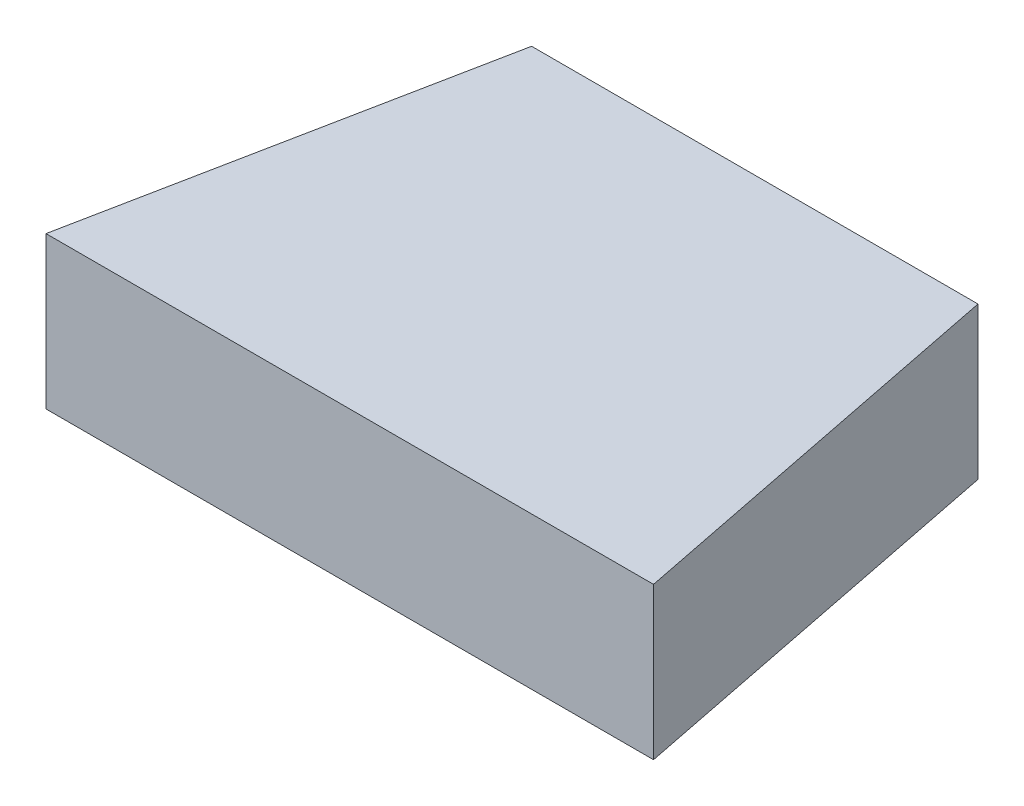
ISO-10303-21;
HEADER;
FILE_DESCRIPTION(('STEP AP214'),'2;1');
FILE_NAME('part.step','',(''),(''),'','','');
FILE_SCHEMA(('AUTOMOTIVE_DESIGN { 1 0 10303 214 1 1 1 1 }'));
ENDSEC;
DATA;
#1=APPLICATION_CONTEXT('core data for automotive mechanical design processes');
#2=APPLICATION_PROTOCOL_DEFINITION('international standard','automotive_design',2000,#1);
#3=PRODUCT_CONTEXT('',#1,'mechanical');
#4=PRODUCT('Part','Part','',(#3));
#5=PRODUCT_RELATED_PRODUCT_CATEGORY('part','',(#4));
#6=PRODUCT_DEFINITION_FORMATION('','',#4);
#7=PRODUCT_DEFINITION_CONTEXT('part definition',#1,'design');
#8=PRODUCT_DEFINITION('design','',#6,#7);
#9=PRODUCT_DEFINITION_SHAPE('','',#8);
#10=(LENGTH_UNIT() NAMED_UNIT(*) SI_UNIT(.MILLI.,.METRE.));
#11=(NAMED_UNIT(*) PLANE_ANGLE_UNIT() SI_UNIT($,.RADIAN.));
#12=(NAMED_UNIT(*) SI_UNIT($,.STERADIAN.) SOLID_ANGLE_UNIT());
#13=UNCERTAINTY_MEASURE_WITH_UNIT(LENGTH_MEASURE(1.E-05),#10,'distance_accuracy_value','');
#14=(GEOMETRIC_REPRESENTATION_CONTEXT(3) GLOBAL_UNCERTAINTY_ASSIGNED_CONTEXT((#13)) GLOBAL_UNIT_ASSIGNED_CONTEXT((#10,
#11,#12)) REPRESENTATION_CONTEXT('',''));
#15=CARTESIAN_POINT('',(0.,0.,0.));
#16=DIRECTION('',(0.,0.,1.));
#17=DIRECTION('',(1.,0.,0.));
#18=AXIS2_PLACEMENT_3D('',#15,#16,#17);
#19=CARTESIAN_POINT('',(-27.9952517371134,19.05,140.741634649995));
#20=DIRECTION('',(0.98078528040323,0.,0.195090322016129));
#21=DIRECTION('',(0.195090322016129,0.,-0.980785280403231));
#22=AXIS2_PLACEMENT_3D('',#19,#20,#21);
#23=PLANE('',#22);
#24=DIRECTION('',(-0.195090322016129,0.,0.98078528040323));
#25=VECTOR('',#24,1.);
#26=CARTESIAN_POINT('',(-27.9952517371134,0.,140.741634649995));
#27=LINE('',#26,#25);
#28=CARTESIAN_POINT('',(-27.9952517371134,0.,140.741634649995));
#29=VERTEX_POINT('',#28);
#30=CARTESIAN_POINT('',(-38.1000000000001,0.,191.541634649995));
#31=VERTEX_POINT('',#30);
#32=EDGE_CURVE('E96',#29,#31,#27,.T.);
#33=ORIENTED_EDGE('',*,*,#32,.T.);
#34=DIRECTION('',(0.,-1.,0.));
#35=VECTOR('',#34,1.);
#36=CARTESIAN_POINT('',(-38.1000000000001,19.05,191.541634649995));
#37=LINE('',#36,#35);
#38=CARTESIAN_POINT('',(-38.1000000000001,19.05,191.541634649995));
#39=VERTEX_POINT('',#38);
#40=EDGE_CURVE('E11',#39,#31,#37,.T.);
#41=ORIENTED_EDGE('',*,*,#40,.F.);
#42=DIRECTION('',(-0.195090322016129,0.,0.98078528040323));
#43=VECTOR('',#42,1.);
#44=CARTESIAN_POINT('',(-27.9952517371134,19.05,140.741634649995));
#45=LINE('',#44,#43);
#46=CARTESIAN_POINT('',(-27.9952517371134,19.05,140.741634649995));
#47=VERTEX_POINT('',#46);
#48=EDGE_CURVE('E84',#47,#39,#45,.T.);
#49=ORIENTED_EDGE('',*,*,#48,.F.);
#50=DIRECTION('',(0.,-1.,0.));
#51=VECTOR('',#50,1.);
#52=CARTESIAN_POINT('',(-27.9952517371134,19.05,140.741634649995));
#53=LINE('',#52,#51);
#54=EDGE_CURVE('E92',#47,#29,#53,.T.);
#55=ORIENTED_EDGE('',*,*,#54,.T.);
#56=EDGE_LOOP('',(#33,#41,#49,#55));
#57=FACE_BOUND('',#56,.T.);
#58=ADVANCED_FACE('F33',(#57),#23,.F.);
#59=CARTESIAN_POINT('',(-38.1000000000001,19.05,191.541634649995));
#60=DIRECTION('',(0.,0.,-1.));
#61=DIRECTION('',(-1.,0.,0.));
#62=AXIS2_PLACEMENT_3D('',#59,#60,#61);
#63=PLANE('',#62);
#64=DIRECTION('',(1.,0.,0.));
#65=VECTOR('',#64,1.);
#66=CARTESIAN_POINT('',(-38.1000000000001,0.,191.541634649995));
#67=LINE('',#66,#65);
#68=CARTESIAN_POINT('',(38.1,0.,191.541634649995));
#69=VERTEX_POINT('',#68);
#70=EDGE_CURVE('E88',#31,#69,#67,.T.);
#71=ORIENTED_EDGE('',*,*,#70,.T.);
#72=DIRECTION('',(0.,-1.,0.));
#73=VECTOR('',#72,1.);
#74=CARTESIAN_POINT('',(38.1,19.05,191.541634649995));
#75=LINE('',#74,#73);
#76=CARTESIAN_POINT('',(38.1,19.05,191.541634649995));
#77=VERTEX_POINT('',#76);
#78=EDGE_CURVE('E41',#77,#69,#75,.T.);
#79=ORIENTED_EDGE('',*,*,#78,.F.);
#80=DIRECTION('',(1.,0.,0.));
#81=VECTOR('',#80,1.);
#82=CARTESIAN_POINT('',(-38.1000000000001,19.05,191.541634649995));
#83=LINE('',#82,#81);
#84=EDGE_CURVE('E79',#39,#77,#83,.T.);
#85=ORIENTED_EDGE('',*,*,#84,.F.);
#86=ORIENTED_EDGE('',*,*,#40,.T.);
#87=EDGE_LOOP('',(#71,#79,#85,#86));
#88=FACE_BOUND('',#87,.T.);
#89=ADVANCED_FACE('F87',(#88),#63,.F.);
#90=CARTESIAN_POINT('',(27.9952517371133,19.05,140.741634649995));
#91=DIRECTION('',(-0.98078528040323,0.,0.195090322016129));
#92=DIRECTION('',(0.195090322016129,0.,0.98078528040323));
#93=AXIS2_PLACEMENT_3D('',#90,#91,#92);
#94=PLANE('',#93);
#95=DIRECTION('',(-0.195090322016129,0.,-0.98078528040323));
#96=VECTOR('',#95,1.);
#97=CARTESIAN_POINT('',(27.9952517371133,0.,140.741634649995));
#98=LINE('',#97,#96);
#99=CARTESIAN_POINT('',(27.9952517371133,0.,140.741634649995));
#100=VERTEX_POINT('',#99);
#101=EDGE_CURVE('E66',#69,#100,#98,.T.);
#102=ORIENTED_EDGE('',*,*,#101,.T.);
#103=DIRECTION('',(0.,-1.,0.));
#104=VECTOR('',#103,1.);
#105=CARTESIAN_POINT('',(27.9952517371133,19.05,140.741634649995));
#106=LINE('',#105,#104);
#107=CARTESIAN_POINT('',(27.9952517371133,19.05,140.741634649995));
#108=VERTEX_POINT('',#107);
#109=EDGE_CURVE('E89',#108,#100,#106,.T.);
#110=ORIENTED_EDGE('',*,*,#109,.F.);
#111=DIRECTION('',(-0.195090322016129,0.,-0.98078528040323));
#112=VECTOR('',#111,1.);
#113=CARTESIAN_POINT('',(27.9952517371133,19.05,140.741634649995));
#114=LINE('',#113,#112);
#115=EDGE_CURVE('E82',#77,#108,#114,.T.);
#116=ORIENTED_EDGE('',*,*,#115,.F.);
#117=ORIENTED_EDGE('',*,*,#78,.T.);
#118=EDGE_LOOP('',(#102,#110,#116,#117));
#119=FACE_BOUND('',#118,.T.);
#120=ADVANCED_FACE('F90',(#119),#94,.F.);
#121=CARTESIAN_POINT('',(-27.9952517371134,19.05,140.741634649995));
#122=DIRECTION('',(0.,0.,1.));
#123=DIRECTION('',(1.,0.,0.));
#124=AXIS2_PLACEMENT_3D('',#121,#122,#123);
#125=PLANE('',#124);
#126=DIRECTION('',(-1.,0.,0.));
#127=VECTOR('',#126,1.);
#128=CARTESIAN_POINT('',(-27.9952517371134,0.,140.741634649995));
#129=LINE('',#128,#127);
#130=EDGE_CURVE('E72',#100,#29,#129,.T.);
#131=ORIENTED_EDGE('',*,*,#130,.T.);
#132=ORIENTED_EDGE('',*,*,#54,.F.);
#133=DIRECTION('',(-1.,0.,0.));
#134=VECTOR('',#133,1.);
#135=CARTESIAN_POINT('',(-27.9952517371134,19.05,140.741634649995));
#136=LINE('',#135,#134);
#137=EDGE_CURVE('E49',#108,#47,#136,.T.);
#138=ORIENTED_EDGE('',*,*,#137,.F.);
#139=ORIENTED_EDGE('',*,*,#109,.T.);
#140=EDGE_LOOP('',(#131,#132,#138,#139));
#141=FACE_BOUND('',#140,.T.);
#142=ADVANCED_FACE('F103',(#141),#125,.F.);
#143=CARTESIAN_POINT('',(0.,19.05,0.));
#144=DIRECTION('',(0.,1.,0.));
#145=DIRECTION('',(0.,0.,1.));
#146=AXIS2_PLACEMENT_3D('',#143,#144,#145);
#147=PLANE('',#146);
#148=ORIENTED_EDGE('',*,*,#48,.T.);
#149=ORIENTED_EDGE('',*,*,#84,.T.);
#150=ORIENTED_EDGE('',*,*,#115,.T.);
#151=ORIENTED_EDGE('',*,*,#137,.T.);
#152=EDGE_LOOP('',(#148,#149,#150,#151));
#153=FACE_BOUND('',#152,.T.);
#154=ADVANCED_FACE('F80',(#153),#147,.T.);
#155=CARTESIAN_POINT('',(0.,0.,0.));
#156=DIRECTION('',(0.,1.,0.));
#157=DIRECTION('',(0.,0.,1.));
#158=AXIS2_PLACEMENT_3D('',#155,#156,#157);
#159=PLANE('',#158);
#160=ORIENTED_EDGE('',*,*,#32,.F.);
#161=ORIENTED_EDGE('',*,*,#130,.F.);
#162=ORIENTED_EDGE('',*,*,#101,.F.);
#163=ORIENTED_EDGE('',*,*,#70,.F.);
#164=EDGE_LOOP('',(#160,#161,#162,#163));
#165=FACE_BOUND('',#164,.T.);
#166=ADVANCED_FACE('F106',(#165),#159,.F.);
#167=CLOSED_SHELL('',(#58,#89,#120,#142,#154,#166));
#168=MANIFOLD_SOLID_BREP('B2',#167);
#169=ADVANCED_BREP_SHAPE_REPRESENTATION('',(#18,#168),#14);
#170=SHAPE_DEFINITION_REPRESENTATION(#9,#169);
ENDSEC;
END-ISO-10303-21;
